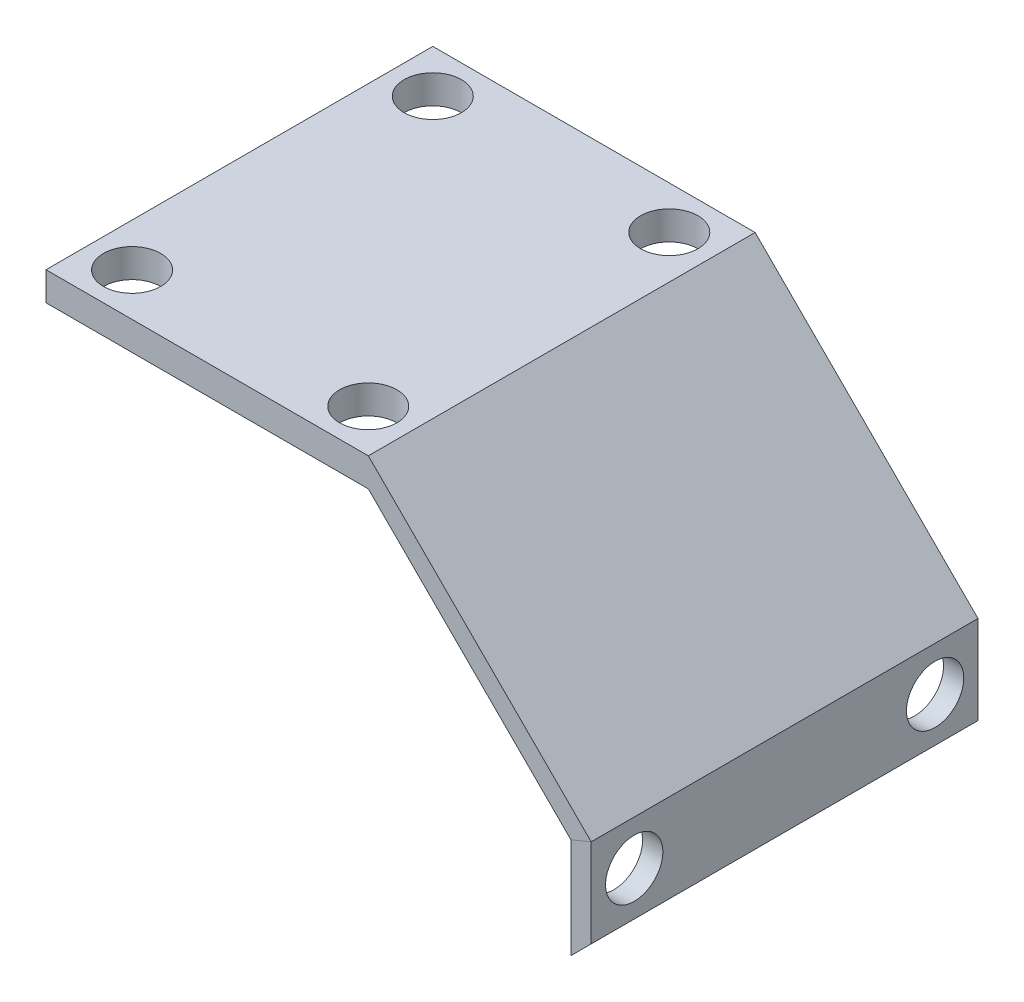
ISO-10303-21;
HEADER;
FILE_DESCRIPTION(('STEP AP214'),'2;1');
FILE_NAME('part.step','',(''),(''),'','','');
FILE_SCHEMA(('AUTOMOTIVE_DESIGN { 1 0 10303 214 1 1 1 1 }'));
ENDSEC;
DATA;
#1=APPLICATION_CONTEXT('core data for automotive mechanical design processes');
#2=APPLICATION_PROTOCOL_DEFINITION('international standard','automotive_design',2000,#1);
#3=PRODUCT_CONTEXT('',#1,'mechanical');
#4=PRODUCT('Part','Part','',(#3));
#5=PRODUCT_RELATED_PRODUCT_CATEGORY('part','',(#4));
#6=PRODUCT_DEFINITION_FORMATION('','',#4);
#7=PRODUCT_DEFINITION_CONTEXT('part definition',#1,'design');
#8=PRODUCT_DEFINITION('design','',#6,#7);
#9=PRODUCT_DEFINITION_SHAPE('','',#8);
#10=(LENGTH_UNIT() NAMED_UNIT(*) SI_UNIT(.MILLI.,.METRE.));
#11=(NAMED_UNIT(*) PLANE_ANGLE_UNIT() SI_UNIT($,.RADIAN.));
#12=(NAMED_UNIT(*) SI_UNIT($,.STERADIAN.) SOLID_ANGLE_UNIT());
#13=UNCERTAINTY_MEASURE_WITH_UNIT(LENGTH_MEASURE(1.E-05),#10,'distance_accuracy_value','');
#14=(GEOMETRIC_REPRESENTATION_CONTEXT(3) GLOBAL_UNCERTAINTY_ASSIGNED_CONTEXT((#13)) GLOBAL_UNIT_ASSIGNED_CONTEXT((#10,
#11,#12)) REPRESENTATION_CONTEXT('',''));
#15=CARTESIAN_POINT('',(0.,0.,0.));
#16=DIRECTION('',(0.,0.,1.));
#17=DIRECTION('',(1.,0.,0.));
#18=AXIS2_PLACEMENT_3D('',#15,#16,#17);
#19=CARTESIAN_POINT('',(-17.9106145251397,5.,-56.9804469273743));
#20=DIRECTION('',(1.,0.,0.));
#21=DIRECTION('',(0.,0.,-1.));
#22=AXIS2_PLACEMENT_3D('',#19,#20,#21);
#23=PLANE('',#22);
#24=DIRECTION('',(0.,0.,1.));
#25=VECTOR('',#24,1.);
#26=CARTESIAN_POINT('',(-17.9106145251397,0.,-56.9804469273743));
#27=LINE('',#26,#25);
#28=CARTESIAN_POINT('',(-17.9106145251397,0.,-56.9804469273743));
#29=VERTEX_POINT('',#28);
#30=CARTESIAN_POINT('',(-17.9106145251397,0.,10.5195530726257));
#31=VERTEX_POINT('',#30);
#32=EDGE_CURVE('E209',#29,#31,#27,.T.);
#33=ORIENTED_EDGE('',*,*,#32,.T.);
#34=DIRECTION('',(0.,-1.,0.));
#35=VECTOR('',#34,1.);
#36=CARTESIAN_POINT('',(-17.9106145251397,5.,10.5195530726257));
#37=LINE('',#36,#35);
#38=CARTESIAN_POINT('',(-17.9106145251397,5.,10.5195530726257));
#39=VERTEX_POINT('',#38);
#40=EDGE_CURVE('E14',#39,#31,#37,.T.);
#41=ORIENTED_EDGE('',*,*,#40,.F.);
#42=DIRECTION('',(0.,0.,1.));
#43=VECTOR('',#42,1.);
#44=CARTESIAN_POINT('',(-17.9106145251397,5.,-56.9804469273743));
#45=LINE('',#44,#43);
#46=CARTESIAN_POINT('',(-17.9106145251397,5.,-56.9804469273743));
#47=VERTEX_POINT('',#46);
#48=EDGE_CURVE('E263',#47,#39,#45,.T.);
#49=ORIENTED_EDGE('',*,*,#48,.F.);
#50=DIRECTION('',(0.,-1.,0.));
#51=VECTOR('',#50,1.);
#52=CARTESIAN_POINT('',(-17.9106145251397,5.,-56.9804469273743));
#53=LINE('',#52,#51);
#54=EDGE_CURVE('E133',#47,#29,#53,.T.);
#55=ORIENTED_EDGE('',*,*,#54,.T.);
#56=EDGE_LOOP('',(#33,#41,#49,#55));
#57=FACE_BOUND('',#56,.T.);
#58=ADVANCED_FACE('F124',(#57),#23,.F.);
#59=CARTESIAN_POINT('',(-17.9106145251397,5.,10.5195530726257));
#60=DIRECTION('',(0.,0.,-1.));
#61=DIRECTION('',(-1.,0.,0.));
#62=AXIS2_PLACEMENT_3D('',#59,#60,#61);
#63=PLANE('',#62);
#64=DIRECTION('',(1.,0.,0.));
#65=VECTOR('',#64,1.);
#66=CARTESIAN_POINT('',(-17.9106145251397,0.,10.5195530726257));
#67=LINE('',#66,#65);
#68=CARTESIAN_POINT('',(38.3393854748604,0.,10.5195530726257));
#69=VERTEX_POINT('',#68);
#70=EDGE_CURVE('E196',#31,#69,#67,.T.);
#71=ORIENTED_EDGE('',*,*,#70,.T.);
#72=DIRECTION('',(0.707106781186546,-0.707106781186549,0.));
#73=VECTOR('',#72,1.);
#74=CARTESIAN_POINT('',(38.3393854748604,0.,10.5195530726257));
#75=LINE('',#74,#73);
#76=CARTESIAN_POINT('',(73.6947245341877,-35.3553390593274,10.5195530726257));
#77=VERTEX_POINT('',#76);
#78=EDGE_CURVE('E205',#69,#77,#75,.T.);
#79=ORIENTED_EDGE('',*,*,#78,.T.);
#80=DIRECTION('',(0.923879532511287,0.38268343236509,0.));
#81=VECTOR('',#80,1.);
#82=CARTESIAN_POINT('',(57.7848219574905,-41.9454364826301,10.5195530726257));
#83=LINE('',#82,#81);
#84=CARTESIAN_POINT('',(77.2302584401204,-33.8908729652602,10.5195530726257));
#85=VERTEX_POINT('',#84);
#86=EDGE_CURVE('E232',#77,#85,#83,.T.);
#87=ORIENTED_EDGE('',*,*,#86,.T.);
#88=DIRECTION('',(0.707106781186546,-0.707106781186549,0.));
#89=VECTOR('',#88,1.);
#90=CARTESIAN_POINT('',(38.3393854748604,5.,10.5195530726257));
#91=LINE('',#90,#89);
#92=CARTESIAN_POINT('',(38.3393854748604,5.,10.5195530726257));
#93=VERTEX_POINT('',#92);
#94=EDGE_CURVE('E216',#93,#85,#91,.T.);
#95=ORIENTED_EDGE('',*,*,#94,.F.);
#96=DIRECTION('',(1.,0.,0.));
#97=VECTOR('',#96,1.);
#98=CARTESIAN_POINT('',(-17.9106145251397,5.,10.5195530726257));
#99=LINE('',#98,#97);
#100=EDGE_CURVE('E167',#39,#93,#99,.T.);
#101=ORIENTED_EDGE('',*,*,#100,.F.);
#102=ORIENTED_EDGE('',*,*,#40,.T.);
#103=EDGE_LOOP('',(#71,#79,#87,#95,#101,#102));
#104=FACE_BOUND('',#103,.T.);
#105=ADVANCED_FACE('F203',(#104),#63,.F.);
#106=CARTESIAN_POINT('',(-17.9106145251397,5.,-56.9804469273743));
#107=DIRECTION('',(0.,0.,1.));
#108=DIRECTION('',(1.,0.,0.));
#109=AXIS2_PLACEMENT_3D('',#106,#107,#108);
#110=PLANE('',#109);
#111=DIRECTION('',(-1.,0.,0.));
#112=VECTOR('',#111,1.);
#113=CARTESIAN_POINT('',(-17.9106145251397,0.,-56.9804469273743));
#114=LINE('',#113,#112);
#115=CARTESIAN_POINT('',(38.3393854748603,0.,-56.9804469273743));
#116=VERTEX_POINT('',#115);
#117=EDGE_CURVE('E156',#116,#29,#114,.T.);
#118=ORIENTED_EDGE('',*,*,#117,.T.);
#119=ORIENTED_EDGE('',*,*,#54,.F.);
#120=DIRECTION('',(-1.,0.,0.));
#121=VECTOR('',#120,1.);
#122=CARTESIAN_POINT('',(-17.9106145251397,5.,-56.9804469273743));
#123=LINE('',#122,#121);
#124=CARTESIAN_POINT('',(38.3393854748603,5.,-56.9804469273743));
#125=VERTEX_POINT('',#124);
#126=EDGE_CURVE('E141',#125,#47,#123,.T.);
#127=ORIENTED_EDGE('',*,*,#126,.F.);
#128=DIRECTION('',(0.707106781186546,-0.707106781186549,0.));
#129=VECTOR('',#128,1.);
#130=CARTESIAN_POINT('',(38.3393854748603,5.,-56.9804469273743));
#131=LINE('',#130,#129);
#132=CARTESIAN_POINT('',(77.2302584401204,-33.8908729652602,-56.9804469273743));
#133=VERTEX_POINT('',#132);
#134=EDGE_CURVE('E220',#125,#133,#131,.T.);
#135=ORIENTED_EDGE('',*,*,#134,.T.);
#136=DIRECTION('',(-0.923879532511287,-0.38268343236509,0.));
#137=VECTOR('',#136,1.);
#138=CARTESIAN_POINT('',(56.0170550045241,-42.6776695296637,-56.9804469273743));
#139=LINE('',#138,#137);
#140=CARTESIAN_POINT('',(73.6947245341877,-35.3553390593274,-56.9804469273743));
#141=VERTEX_POINT('',#140);
#142=EDGE_CURVE('E290',#133,#141,#139,.T.);
#143=ORIENTED_EDGE('',*,*,#142,.T.);
#144=DIRECTION('',(0.707106781186546,-0.707106781186549,0.));
#145=VECTOR('',#144,1.);
#146=CARTESIAN_POINT('',(38.3393854748603,0.,-56.9804469273743));
#147=LINE('',#146,#145);
#148=EDGE_CURVE('E215',#116,#141,#147,.T.);
#149=ORIENTED_EDGE('',*,*,#148,.F.);
#150=EDGE_LOOP('',(#118,#119,#127,#135,#143,#149));
#151=FACE_BOUND('',#150,.T.);
#152=ADVANCED_FACE('F279',(#151),#110,.F.);
#153=CARTESIAN_POINT('',(0.,5.,0.));
#154=DIRECTION('',(0.,1.,0.));
#155=DIRECTION('',(0.,0.,1.));
#156=AXIS2_PLACEMENT_3D('',#153,#154,#155);
#157=PLANE('',#156);
#158=CARTESIAN_POINT('',(30.8064867747202,5.,-49.5272979985413));
#159=DIRECTION('',(0.,1.,0.));
#160=DIRECTION('',(0.,0.,1.));
#161=AXIS2_PLACEMENT_3D('',#158,#159,#160);
#162=CIRCLE('',#161,5.);
#163=CARTESIAN_POINT('',(30.8064867747202,5.,-44.5272979985413));
#164=VERTEX_POINT('',#163);
#165=EDGE_CURVE('E319',#164,#164,#162,.T.);
#166=ORIENTED_EDGE('',*,*,#165,.F.);
#167=EDGE_LOOP('',(#166));
#168=FACE_BOUND('',#167,.T.);
#169=CARTESIAN_POINT('',(30.8460975901686,5.,3.04277191318188));
#170=DIRECTION('',(0.,1.,0.));
#171=DIRECTION('',(0.,0.,1.));
#172=AXIS2_PLACEMENT_3D('',#169,#170,#171);
#173=CIRCLE('',#172,5.);
#174=CARTESIAN_POINT('',(30.8460975901686,5.,8.04277191318188));
#175=VERTEX_POINT('',#174);
#176=EDGE_CURVE('E311',#175,#175,#173,.T.);
#177=ORIENTED_EDGE('',*,*,#176,.F.);
#178=EDGE_LOOP('',(#177));
#179=FACE_BOUND('',#178,.T.);
#180=CARTESIAN_POINT('',(-10.3943048217647,5.,-49.4604020444531));
#181=DIRECTION('',(0.,1.,0.));
#182=DIRECTION('',(0.,0.,1.));
#183=AXIS2_PLACEMENT_3D('',#180,#181,#182);
#184=CIRCLE('',#183,5.);
#185=CARTESIAN_POINT('',(-10.3943048217647,5.,-44.4604020444531));
#186=VERTEX_POINT('',#185);
#187=EDGE_CURVE('E303',#186,#186,#184,.T.);
#188=ORIENTED_EDGE('',*,*,#187,.F.);
#189=EDGE_LOOP('',(#188));
#190=FACE_BOUND('',#189,.T.);
#191=CARTESIAN_POINT('',(-10.3648880622202,5.,3.04275475262796));
#192=DIRECTION('',(0.,1.,0.));
#193=DIRECTION('',(0.,0.,1.));
#194=AXIS2_PLACEMENT_3D('',#191,#192,#193);
#195=CIRCLE('',#194,5.);
#196=CARTESIAN_POINT('',(-10.3648880622202,5.,8.04275475262796));
#197=VERTEX_POINT('',#196);
#198=EDGE_CURVE('E295',#197,#197,#195,.T.);
#199=ORIENTED_EDGE('',*,*,#198,.F.);
#200=EDGE_LOOP('',(#199));
#201=FACE_BOUND('',#200,.T.);
#202=ORIENTED_EDGE('',*,*,#48,.T.);
#203=ORIENTED_EDGE('',*,*,#100,.T.);
#204=DIRECTION('',(0.,0.,-1.));
#205=VECTOR('',#204,1.);
#206=CARTESIAN_POINT('',(38.3393854748603,5.,-56.9804469273743));
#207=LINE('',#206,#205);
#208=EDGE_CURVE('E268',#93,#125,#207,.T.);
#209=ORIENTED_EDGE('',*,*,#208,.T.);
#210=ORIENTED_EDGE('',*,*,#126,.T.);
#211=EDGE_LOOP('',(#202,#203,#209,#210));
#212=FACE_BOUND('',#211,.T.);
#213=ADVANCED_FACE('F372',(#168,#179,#190,#201,#212),#157,.T.);
#214=CARTESIAN_POINT('',(0.,0.,0.));
#215=DIRECTION('',(0.,1.,0.));
#216=DIRECTION('',(0.,0.,1.));
#217=AXIS2_PLACEMENT_3D('',#214,#215,#216);
#218=PLANE('',#217);
#219=CARTESIAN_POINT('',(30.8064867747202,0.,-49.5272979985413));
#220=DIRECTION('',(0.,1.,0.));
#221=DIRECTION('',(0.,0.,1.));
#222=AXIS2_PLACEMENT_3D('',#219,#220,#221);
#223=CIRCLE('',#222,5.);
#224=CARTESIAN_POINT('',(30.8064867747202,0.,-44.5272979985413));
#225=VERTEX_POINT('',#224);
#226=EDGE_CURVE('E315',#225,#225,#223,.T.);
#227=ORIENTED_EDGE('',*,*,#226,.T.);
#228=EDGE_LOOP('',(#227));
#229=FACE_BOUND('',#228,.T.);
#230=CARTESIAN_POINT('',(30.8460975901686,0.,3.04277191318188));
#231=DIRECTION('',(0.,1.,0.));
#232=DIRECTION('',(0.,0.,1.));
#233=AXIS2_PLACEMENT_3D('',#230,#231,#232);
#234=CIRCLE('',#233,5.);
#235=CARTESIAN_POINT('',(30.8460975901686,0.,8.04277191318188));
#236=VERTEX_POINT('',#235);
#237=EDGE_CURVE('E307',#236,#236,#234,.T.);
#238=ORIENTED_EDGE('',*,*,#237,.T.);
#239=EDGE_LOOP('',(#238));
#240=FACE_BOUND('',#239,.T.);
#241=CARTESIAN_POINT('',(-10.3943048217647,0.,-49.4604020444531));
#242=DIRECTION('',(0.,1.,0.));
#243=DIRECTION('',(0.,0.,1.));
#244=AXIS2_PLACEMENT_3D('',#241,#242,#243);
#245=CIRCLE('',#244,5.);
#246=CARTESIAN_POINT('',(-10.3943048217647,0.,-44.4604020444531));
#247=VERTEX_POINT('',#246);
#248=EDGE_CURVE('E299',#247,#247,#245,.T.);
#249=ORIENTED_EDGE('',*,*,#248,.T.);
#250=EDGE_LOOP('',(#249));
#251=FACE_BOUND('',#250,.T.);
#252=CARTESIAN_POINT('',(-10.3648880622202,0.,3.04275475262796));
#253=DIRECTION('',(0.,1.,0.));
#254=DIRECTION('',(0.,0.,1.));
#255=AXIS2_PLACEMENT_3D('',#252,#253,#254);
#256=CIRCLE('',#255,5.);
#257=CARTESIAN_POINT('',(-10.3648880622202,0.,8.04275475262796));
#258=VERTEX_POINT('',#257);
#259=EDGE_CURVE('E239',#258,#258,#256,.T.);
#260=ORIENTED_EDGE('',*,*,#259,.T.);
#261=EDGE_LOOP('',(#260));
#262=FACE_BOUND('',#261,.T.);
#263=ORIENTED_EDGE('',*,*,#32,.F.);
#264=ORIENTED_EDGE('',*,*,#117,.F.);
#265=DIRECTION('',(0.,0.,-1.));
#266=VECTOR('',#265,1.);
#267=CARTESIAN_POINT('',(38.3393854748603,0.,-56.9804469273743));
#268=LINE('',#267,#266);
#269=EDGE_CURVE('E193',#69,#116,#268,.T.);
#270=ORIENTED_EDGE('',*,*,#269,.F.);
#271=ORIENTED_EDGE('',*,*,#70,.F.);
#272=EDGE_LOOP('',(#263,#264,#270,#271));
#273=FACE_BOUND('',#272,.T.);
#274=ADVANCED_FACE('F195',(#229,#240,#251,#262,#273),#218,.F.);
#275=CARTESIAN_POINT('',(73.6947245341877,-52.8553390593274,0.));
#276=DIRECTION('',(0.707106781186551,-0.707106781186544,0.));
#277=DIRECTION('',(0.,0.,-1.));
#278=AXIS2_PLACEMENT_3D('',#275,#276,#277);
#279=PLANE('',#278);
#280=DIRECTION('',(-0.707106781186544,-0.707106781186551,0.));
#281=VECTOR('',#280,1.);
#282=CARTESIAN_POINT('',(77.2302584401205,-49.3198051533946,10.5195530726257));
#283=LINE('',#282,#281);
#284=CARTESIAN_POINT('',(77.2302584401205,-49.3198051533946,10.5195530726257));
#285=VERTEX_POINT('',#284);
#286=CARTESIAN_POINT('',(73.6947245341877,-52.8553390593274,10.5195530726257));
#287=VERTEX_POINT('',#286);
#288=EDGE_CURVE('E254',#285,#287,#283,.T.);
#289=ORIENTED_EDGE('',*,*,#288,.T.);
#290=DIRECTION('',(0.,0.,-1.));
#291=VECTOR('',#290,1.);
#292=CARTESIAN_POINT('',(73.6947245341877,-52.8553390593274,10.5195530726257));
#293=LINE('',#292,#291);
#294=CARTESIAN_POINT('',(73.6947245341877,-52.8553390593274,-56.9804469273743));
#295=VERTEX_POINT('',#294);
#296=EDGE_CURVE('E247',#287,#295,#293,.T.);
#297=ORIENTED_EDGE('',*,*,#296,.T.);
#298=DIRECTION('',(0.707106781186544,0.707106781186551,0.));
#299=VECTOR('',#298,1.);
#300=CARTESIAN_POINT('',(73.6947245341877,-52.8553390593274,-56.9804469273743));
#301=LINE('',#300,#299);
#302=CARTESIAN_POINT('',(77.2302584401204,-49.3198051533946,-56.9804469273743));
#303=VERTEX_POINT('',#302);
#304=EDGE_CURVE('E240',#295,#303,#301,.T.);
#305=ORIENTED_EDGE('',*,*,#304,.T.);
#306=DIRECTION('',(0.,0.,1.));
#307=VECTOR('',#306,1.);
#308=CARTESIAN_POINT('',(77.2302584401204,-49.3198051533946,-56.9804469273743));
#309=LINE('',#308,#307);
#310=EDGE_CURVE('E235',#303,#285,#309,.T.);
#311=ORIENTED_EDGE('',*,*,#310,.T.);
#312=EDGE_LOOP('',(#289,#297,#305,#311));
#313=FACE_BOUND('',#312,.T.);
#314=ADVANCED_FACE('F377',(#313),#279,.T.);
#315=CARTESIAN_POINT('',(77.2302584401204,-31.8198051533947,10.5195530726257));
#316=DIRECTION('',(0.,0.,1.));
#317=DIRECTION('',(1.,0.,0.));
#318=AXIS2_PLACEMENT_3D('',#315,#316,#317);
#319=PLANE('',#318);
#320=ORIENTED_EDGE('',*,*,#86,.F.);
#321=DIRECTION('',(0.,-1.,0.));
#322=VECTOR('',#321,1.);
#323=CARTESIAN_POINT('',(73.6947245341877,-35.3553390593274,10.5195530726257));
#324=LINE('',#323,#322);
#325=EDGE_CURVE('E250',#77,#287,#324,.T.);
#326=ORIENTED_EDGE('',*,*,#325,.T.);
#327=ORIENTED_EDGE('',*,*,#288,.F.);
#328=DIRECTION('',(0.,-1.,0.));
#329=VECTOR('',#328,1.);
#330=CARTESIAN_POINT('',(77.2302584401204,-31.8198051533947,10.5195530726257));
#331=LINE('',#330,#329);
#332=EDGE_CURVE('E223',#85,#285,#331,.T.);
#333=ORIENTED_EDGE('',*,*,#332,.F.);
#334=EDGE_LOOP('',(#320,#326,#327,#333));
#335=FACE_BOUND('',#334,.T.);
#336=ADVANCED_FACE('F383',(#335),#319,.T.);
#337=CARTESIAN_POINT('',(73.6947245341877,-35.3553390593274,10.5195530726257));
#338=DIRECTION('',(-1.,0.,0.));
#339=DIRECTION('',(0.,-1.,0.));
#340=AXIS2_PLACEMENT_3D('',#337,#338,#339);
#341=PLANE('',#340);
#342=CARTESIAN_POINT('',(73.6947245341877,-41.6162010225842,-49.4984638704597));
#343=DIRECTION('',(-1.,0.,0.));
#344=DIRECTION('',(0.,-1.,0.));
#345=AXIS2_PLACEMENT_3D('',#342,#343,#344);
#346=CIRCLE('',#345,5.);
#347=CARTESIAN_POINT('',(73.6947245341877,-46.6162010225842,-49.4984638704597));
#348=VERTEX_POINT('',#347);
#349=EDGE_CURVE('E334',#348,#348,#346,.T.);
#350=ORIENTED_EDGE('',*,*,#349,.F.);
#351=EDGE_LOOP('',(#350));
#352=FACE_BOUND('',#351,.T.);
#353=CARTESIAN_POINT('',(73.6947245341877,-41.642500370359,3.01491967827499));
#354=DIRECTION('',(-1.,0.,0.));
#355=DIRECTION('',(0.,-1.,0.));
#356=AXIS2_PLACEMENT_3D('',#353,#354,#355);
#357=CIRCLE('',#356,5.);
#358=CARTESIAN_POINT('',(73.6947245341877,-46.642500370359,3.01491967827499));
#359=VERTEX_POINT('',#358);
#360=EDGE_CURVE('E323',#359,#359,#357,.T.);
#361=ORIENTED_EDGE('',*,*,#360,.F.);
#362=EDGE_LOOP('',(#361));
#363=FACE_BOUND('',#362,.T.);
#364=DIRECTION('',(0.,-1.,0.));
#365=VECTOR('',#364,1.);
#366=CARTESIAN_POINT('',(73.6947245341877,-35.3553390593274,-56.9804469273743));
#367=LINE('',#366,#365);
#368=EDGE_CURVE('E243',#141,#295,#367,.T.);
#369=ORIENTED_EDGE('',*,*,#368,.T.);
#370=ORIENTED_EDGE('',*,*,#296,.F.);
#371=ORIENTED_EDGE('',*,*,#325,.F.);
#372=DIRECTION('',(0.,0.,1.));
#373=VECTOR('',#372,1.);
#374=CARTESIAN_POINT('',(73.6947245341877,-35.3553390593274,10.5195530726257));
#375=LINE('',#374,#373);
#376=EDGE_CURVE('E213',#141,#77,#375,.T.);
#377=ORIENTED_EDGE('',*,*,#376,.F.);
#378=EDGE_LOOP('',(#369,#370,#371,#377));
#379=FACE_BOUND('',#378,.T.);
#380=ADVANCED_FACE('F421',(#352,#363,#379),#341,.T.);
#381=CARTESIAN_POINT('',(73.6947245341877,-35.3553390593274,-56.9804469273743));
#382=DIRECTION('',(0.,0.,-1.));
#383=DIRECTION('',(-1.,0.,0.));
#384=AXIS2_PLACEMENT_3D('',#381,#382,#383);
#385=PLANE('',#384);
#386=ORIENTED_EDGE('',*,*,#142,.F.);
#387=DIRECTION('',(0.,-1.,0.));
#388=VECTOR('',#387,1.);
#389=CARTESIAN_POINT('',(77.2302584401204,-31.8198051533947,-56.9804469273743));
#390=LINE('',#389,#388);
#391=EDGE_CURVE('E238',#133,#303,#390,.T.);
#392=ORIENTED_EDGE('',*,*,#391,.T.);
#393=ORIENTED_EDGE('',*,*,#304,.F.);
#394=ORIENTED_EDGE('',*,*,#368,.F.);
#395=EDGE_LOOP('',(#386,#392,#393,#394));
#396=FACE_BOUND('',#395,.T.);
#397=ADVANCED_FACE('F348',(#396),#385,.T.);
#398=CARTESIAN_POINT('',(77.2302584401204,-31.8198051533947,-56.9804469273743));
#399=DIRECTION('',(1.,0.,0.));
#400=DIRECTION('',(0.,1.,0.));
#401=AXIS2_PLACEMENT_3D('',#398,#399,#400);
#402=PLANE('',#401);
#403=CARTESIAN_POINT('',(77.2302584401204,-41.6162010225842,-49.4984638704597));
#404=DIRECTION('',(1.,0.,0.));
#405=DIRECTION('',(0.,1.,0.));
#406=AXIS2_PLACEMENT_3D('',#403,#404,#405);
#407=CIRCLE('',#406,5.);
#408=CARTESIAN_POINT('',(77.2302584401204,-36.6162010225842,-49.4984638704597));
#409=VERTEX_POINT('',#408);
#410=EDGE_CURVE('E338',#409,#409,#407,.T.);
#411=ORIENTED_EDGE('',*,*,#410,.F.);
#412=EDGE_LOOP('',(#411));
#413=FACE_BOUND('',#412,.T.);
#414=CARTESIAN_POINT('',(77.2302584401204,-41.642500370359,3.01491967827499));
#415=DIRECTION('',(1.,0.,0.));
#416=DIRECTION('',(0.,1.,0.));
#417=AXIS2_PLACEMENT_3D('',#414,#415,#416);
#418=CIRCLE('',#417,5.);
#419=CARTESIAN_POINT('',(77.2302584401204,-36.642500370359,3.01491967827499));
#420=VERTEX_POINT('',#419);
#421=EDGE_CURVE('E330',#420,#420,#418,.T.);
#422=ORIENTED_EDGE('',*,*,#421,.F.);
#423=EDGE_LOOP('',(#422));
#424=FACE_BOUND('',#423,.T.);
#425=DIRECTION('',(0.,0.,-1.));
#426=VECTOR('',#425,1.);
#427=CARTESIAN_POINT('',(77.2302584401204,-33.8908729652602,-56.9804469273743));
#428=LINE('',#427,#426);
#429=EDGE_CURVE('E226',#85,#133,#428,.T.);
#430=ORIENTED_EDGE('',*,*,#429,.F.);
#431=ORIENTED_EDGE('',*,*,#332,.T.);
#432=ORIENTED_EDGE('',*,*,#310,.F.);
#433=ORIENTED_EDGE('',*,*,#391,.F.);
#434=EDGE_LOOP('',(#430,#431,#432,#433));
#435=FACE_BOUND('',#434,.T.);
#436=ADVANCED_FACE('F345',(#413,#424,#435),#402,.T.);
#437=CARTESIAN_POINT('',(38.3393854748603,5.,-56.9804469273743));
#438=DIRECTION('',(0.707106781186549,0.707106781186546,0.));
#439=DIRECTION('',(-0.707106781186546,0.707106781186549,0.));
#440=AXIS2_PLACEMENT_3D('',#437,#438,#439);
#441=PLANE('',#440);
#442=ORIENTED_EDGE('',*,*,#94,.T.);
#443=ORIENTED_EDGE('',*,*,#429,.T.);
#444=ORIENTED_EDGE('',*,*,#134,.F.);
#445=ORIENTED_EDGE('',*,*,#208,.F.);
#446=EDGE_LOOP('',(#442,#443,#444,#445));
#447=FACE_BOUND('',#446,.T.);
#448=ADVANCED_FACE('F285',(#447),#441,.T.);
#449=CARTESIAN_POINT('',(38.3393854748604,0.,10.5195530726257));
#450=DIRECTION('',(-0.707106781186549,-0.707106781186546,0.));
#451=DIRECTION('',(0.707106781186546,-0.707106781186549,0.));
#452=AXIS2_PLACEMENT_3D('',#449,#450,#451);
#453=PLANE('',#452);
#454=ORIENTED_EDGE('',*,*,#148,.T.);
#455=ORIENTED_EDGE('',*,*,#376,.T.);
#456=ORIENTED_EDGE('',*,*,#78,.F.);
#457=ORIENTED_EDGE('',*,*,#269,.T.);
#458=EDGE_LOOP('',(#454,#455,#456,#457));
#459=FACE_BOUND('',#458,.T.);
#460=ADVANCED_FACE('F212',(#459),#453,.T.);
#461=CARTESIAN_POINT('',(-10.3648880622202,0.,3.04275475262796));
#462=DIRECTION('',(0.,1.,0.));
#463=DIRECTION('',(0.,0.,1.));
#464=AXIS2_PLACEMENT_3D('',#461,#462,#463);
#465=CYLINDRICAL_SURFACE('',#464,5.);
#466=ORIENTED_EDGE('',*,*,#259,.F.);
#467=EDGE_LOOP('',(#466));
#468=FACE_BOUND('',#467,.T.);
#469=ORIENTED_EDGE('',*,*,#198,.T.);
#470=EDGE_LOOP('',(#469));
#471=FACE_BOUND('',#470,.T.);
#472=ADVANCED_FACE('F385',(#468,#471),#465,.F.);
#473=CARTESIAN_POINT('',(-10.3943048217647,0.,-49.4604020444531));
#474=DIRECTION('',(0.,1.,0.));
#475=DIRECTION('',(0.,0.,1.));
#476=AXIS2_PLACEMENT_3D('',#473,#474,#475);
#477=CYLINDRICAL_SURFACE('',#476,5.);
#478=ORIENTED_EDGE('',*,*,#248,.F.);
#479=EDGE_LOOP('',(#478));
#480=FACE_BOUND('',#479,.T.);
#481=ORIENTED_EDGE('',*,*,#187,.T.);
#482=EDGE_LOOP('',(#481));
#483=FACE_BOUND('',#482,.T.);
#484=ADVANCED_FACE('F435',(#480,#483),#477,.F.);
#485=CARTESIAN_POINT('',(30.8460975901686,0.,3.04277191318188));
#486=DIRECTION('',(0.,1.,0.));
#487=DIRECTION('',(0.,0.,1.));
#488=AXIS2_PLACEMENT_3D('',#485,#486,#487);
#489=CYLINDRICAL_SURFACE('',#488,5.);
#490=ORIENTED_EDGE('',*,*,#237,.F.);
#491=EDGE_LOOP('',(#490));
#492=FACE_BOUND('',#491,.T.);
#493=ORIENTED_EDGE('',*,*,#176,.T.);
#494=EDGE_LOOP('',(#493));
#495=FACE_BOUND('',#494,.T.);
#496=ADVANCED_FACE('F362',(#492,#495),#489,.F.);
#497=CARTESIAN_POINT('',(30.8064867747202,0.,-49.5272979985413));
#498=DIRECTION('',(0.,1.,0.));
#499=DIRECTION('',(0.,0.,1.));
#500=AXIS2_PLACEMENT_3D('',#497,#498,#499);
#501=CYLINDRICAL_SURFACE('',#500,5.);
#502=ORIENTED_EDGE('',*,*,#226,.F.);
#503=EDGE_LOOP('',(#502));
#504=FACE_BOUND('',#503,.T.);
#505=ORIENTED_EDGE('',*,*,#165,.T.);
#506=EDGE_LOOP('',(#505));
#507=FACE_BOUND('',#506,.T.);
#508=ADVANCED_FACE('F353',(#504,#507),#501,.F.);
#509=CARTESIAN_POINT('',(72.2302584401204,-41.642500370359,3.01491967827499));
#510=DIRECTION('',(1.,0.,0.));
#511=DIRECTION('',(0.,1.,0.));
#512=AXIS2_PLACEMENT_3D('',#509,#510,#511);
#513=CYLINDRICAL_SURFACE('',#512,5.);
#514=ORIENTED_EDGE('',*,*,#360,.T.);
#515=EDGE_LOOP('',(#514));
#516=FACE_BOUND('',#515,.T.);
#517=ORIENTED_EDGE('',*,*,#421,.T.);
#518=EDGE_LOOP('',(#517));
#519=FACE_BOUND('',#518,.T.);
#520=ADVANCED_FACE('F351',(#516,#519),#513,.F.);
#521=CARTESIAN_POINT('',(72.2302584401204,-41.6162010225842,-49.4984638704597));
#522=DIRECTION('',(1.,0.,0.));
#523=DIRECTION('',(0.,1.,0.));
#524=AXIS2_PLACEMENT_3D('',#521,#522,#523);
#525=CYLINDRICAL_SURFACE('',#524,5.);
#526=ORIENTED_EDGE('',*,*,#349,.T.);
#527=EDGE_LOOP('',(#526));
#528=FACE_BOUND('',#527,.T.);
#529=ORIENTED_EDGE('',*,*,#410,.T.);
#530=EDGE_LOOP('',(#529));
#531=FACE_BOUND('',#530,.T.);
#532=ADVANCED_FACE('F343',(#528,#531),#525,.F.);
#533=CLOSED_SHELL('',(#58,#105,#152,#213,#274,#314,#336,#380,#397,#436,#448,#460,#472,#484,#496,
#508,#520,#532));
#534=MANIFOLD_SOLID_BREP('B2',#533);
#535=ADVANCED_BREP_SHAPE_REPRESENTATION('',(#18,#534),#14);
#536=SHAPE_DEFINITION_REPRESENTATION(#9,#535);
ENDSEC;
END-ISO-10303-21;
